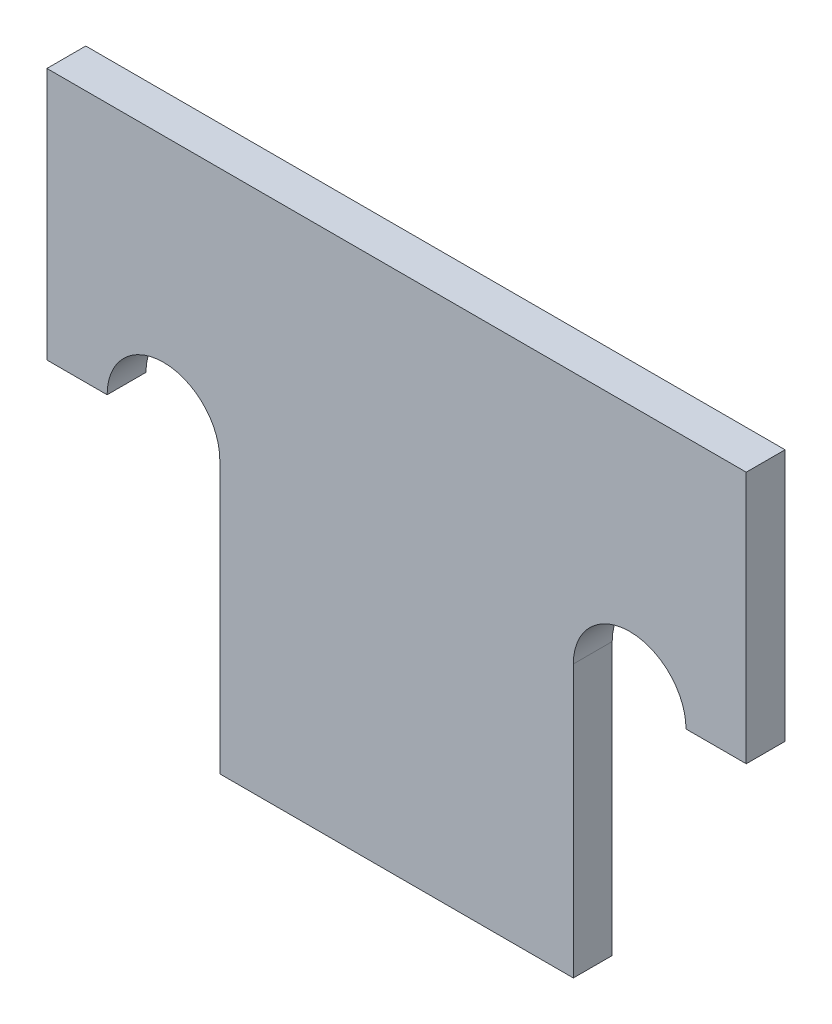
ISO-10303-21;
HEADER;
FILE_DESCRIPTION(('STEP AP214'),'2;1');
FILE_NAME('part.step','',(''),(''),'','','');
FILE_SCHEMA(('AUTOMOTIVE_DESIGN { 1 0 10303 214 1 1 1 1 }'));
ENDSEC;
DATA;
#1=APPLICATION_CONTEXT('core data for automotive mechanical design processes');
#2=APPLICATION_PROTOCOL_DEFINITION('international standard','automotive_design',2000,#1);
#3=PRODUCT_CONTEXT('',#1,'mechanical');
#4=PRODUCT('Part','Part','',(#3));
#5=PRODUCT_RELATED_PRODUCT_CATEGORY('part','',(#4));
#6=PRODUCT_DEFINITION_FORMATION('','',#4);
#7=PRODUCT_DEFINITION_CONTEXT('part definition',#1,'design');
#8=PRODUCT_DEFINITION('design','',#6,#7);
#9=PRODUCT_DEFINITION_SHAPE('','',#8);
#10=(LENGTH_UNIT() NAMED_UNIT(*) SI_UNIT(.MILLI.,.METRE.));
#11=(NAMED_UNIT(*) PLANE_ANGLE_UNIT() SI_UNIT($,.RADIAN.));
#12=(NAMED_UNIT(*) SI_UNIT($,.STERADIAN.) SOLID_ANGLE_UNIT());
#13=UNCERTAINTY_MEASURE_WITH_UNIT(LENGTH_MEASURE(1.E-05),#10,'distance_accuracy_value','');
#14=(GEOMETRIC_REPRESENTATION_CONTEXT(3) GLOBAL_UNCERTAINTY_ASSIGNED_CONTEXT((#13)) GLOBAL_UNIT_ASSIGNED_CONTEXT((#10,
#11,#12)) REPRESENTATION_CONTEXT('',''));
#15=CARTESIAN_POINT('',(0.,0.,0.));
#16=DIRECTION('',(0.,0.,1.));
#17=DIRECTION('',(1.,0.,0.));
#18=AXIS2_PLACEMENT_3D('',#15,#16,#17);
#19=CARTESIAN_POINT('',(0.,0.,2.54));
#20=DIRECTION('',(0.,0.,-1.));
#21=DIRECTION('',(-1.,0.,0.));
#22=AXIS2_PLACEMENT_3D('',#19,#20,#21);
#23=PLANE('',#22);
#24=DIRECTION('',(1.,0.,0.));
#25=VECTOR('',#24,1.);
#26=CARTESIAN_POINT('',(18.923,0.635000000000004,2.54));
#27=LINE('',#26,#25);
#28=CARTESIAN_POINT('',(18.923,0.635000000000004,2.54));
#29=VERTEX_POINT('',#28);
#30=CARTESIAN_POINT('',(22.86,0.635000000000004,2.54));
#31=VERTEX_POINT('',#30);
#32=EDGE_CURVE('E129',#29,#31,#27,.T.);
#33=ORIENTED_EDGE('',*,*,#32,.T.);
#34=DIRECTION('',(0.,1.,0.));
#35=VECTOR('',#34,1.);
#36=CARTESIAN_POINT('',(22.86,-17.145,2.54));
#37=LINE('',#36,#35);
#38=CARTESIAN_POINT('',(22.86,17.145,2.54));
#39=VERTEX_POINT('',#38);
#40=EDGE_CURVE('E196',#31,#39,#37,.T.);
#41=ORIENTED_EDGE('',*,*,#40,.T.);
#42=DIRECTION('',(-1.,0.,0.));
#43=VECTOR('',#42,1.);
#44=CARTESIAN_POINT('',(-22.86,17.145,2.54));
#45=LINE('',#44,#43);
#46=CARTESIAN_POINT('',(-22.86,17.145,2.54));
#47=VERTEX_POINT('',#46);
#48=EDGE_CURVE('E199',#39,#47,#45,.T.);
#49=ORIENTED_EDGE('',*,*,#48,.T.);
#50=DIRECTION('',(0.,-1.,0.));
#51=VECTOR('',#50,1.);
#52=CARTESIAN_POINT('',(-22.86,-17.145,2.54));
#53=LINE('',#52,#51);
#54=CARTESIAN_POINT('',(-22.86,0.635000000000003,2.54));
#55=VERTEX_POINT('',#54);
#56=EDGE_CURVE('E203',#47,#55,#53,.T.);
#57=ORIENTED_EDGE('',*,*,#56,.T.);
#58=DIRECTION('',(1.,0.,0.));
#59=VECTOR('',#58,1.);
#60=CARTESIAN_POINT('',(-18.923,0.635000000000004,2.54));
#61=LINE('',#60,#59);
#62=CARTESIAN_POINT('',(-18.923,0.635000000000004,2.54));
#63=VERTEX_POINT('',#62);
#64=EDGE_CURVE('E169',#55,#63,#61,.T.);
#65=ORIENTED_EDGE('',*,*,#64,.T.);
#66=CARTESIAN_POINT('',(-15.24,0.635000000000004,2.54));
#67=DIRECTION('',(0.,0.,-1.));
#68=DIRECTION('',(-1.,0.,0.));
#69=AXIS2_PLACEMENT_3D('',#66,#67,#68);
#70=CIRCLE('',#69,3.683);
#71=CARTESIAN_POINT('',(-11.557,0.635000000000004,2.54));
#72=VERTEX_POINT('',#71);
#73=EDGE_CURVE('E148',#63,#72,#70,.T.);
#74=ORIENTED_EDGE('',*,*,#73,.T.);
#75=DIRECTION('',(0.,-1.,0.));
#76=VECTOR('',#75,1.);
#77=CARTESIAN_POINT('',(-11.557,0.635000000000003,2.54));
#78=LINE('',#77,#76);
#79=CARTESIAN_POINT('',(-11.557,-17.145,2.54));
#80=VERTEX_POINT('',#79);
#81=EDGE_CURVE('E144',#72,#80,#78,.T.);
#82=ORIENTED_EDGE('',*,*,#81,.T.);
#83=DIRECTION('',(1.,0.,0.));
#84=VECTOR('',#83,1.);
#85=CARTESIAN_POINT('',(-22.86,-17.145,2.54));
#86=LINE('',#85,#84);
#87=CARTESIAN_POINT('',(11.557,-17.145,2.54));
#88=VERTEX_POINT('',#87);
#89=EDGE_CURVE('E207',#80,#88,#86,.T.);
#90=ORIENTED_EDGE('',*,*,#89,.T.);
#91=DIRECTION('',(0.,1.,0.));
#92=VECTOR('',#91,1.);
#93=CARTESIAN_POINT('',(11.557,0.635000000000003,2.54));
#94=LINE('',#93,#92);
#95=CARTESIAN_POINT('',(11.557,0.635000000000003,2.54));
#96=VERTEX_POINT('',#95);
#97=EDGE_CURVE('E57',#88,#96,#94,.T.);
#98=ORIENTED_EDGE('',*,*,#97,.T.);
#99=CARTESIAN_POINT('',(15.24,0.635000000000004,2.54));
#100=DIRECTION('',(0.,0.,-1.));
#101=DIRECTION('',(-1.,0.,0.));
#102=AXIS2_PLACEMENT_3D('',#99,#100,#101);
#103=CIRCLE('',#102,3.683);
#104=EDGE_CURVE('E127',#96,#29,#103,.T.);
#105=ORIENTED_EDGE('',*,*,#104,.T.);
#106=EDGE_LOOP('',(#33,#41,#49,#57,#65,#74,#82,#90,#98,#105));
#107=FACE_BOUND('',#106,.T.);
#108=ADVANCED_FACE('F41',(#107),#23,.F.);
#109=CARTESIAN_POINT('',(0.,0.,0.));
#110=DIRECTION('',(0.,0.,-1.));
#111=DIRECTION('',(-1.,0.,0.));
#112=AXIS2_PLACEMENT_3D('',#109,#110,#111);
#113=PLANE('',#112);
#114=DIRECTION('',(0.,1.,0.));
#115=VECTOR('',#114,1.);
#116=CARTESIAN_POINT('',(22.86,-17.145,0.));
#117=LINE('',#116,#115);
#118=CARTESIAN_POINT('',(22.86,0.635000000000004,0.));
#119=VERTEX_POINT('',#118);
#120=CARTESIAN_POINT('',(22.86,17.145,0.));
#121=VERTEX_POINT('',#120);
#122=EDGE_CURVE('E211',#119,#121,#117,.T.);
#123=ORIENTED_EDGE('',*,*,#122,.F.);
#124=DIRECTION('',(-1.,0.,0.));
#125=VECTOR('',#124,1.);
#126=CARTESIAN_POINT('',(18.923,0.635000000000004,0.));
#127=LINE('',#126,#125);
#128=CARTESIAN_POINT('',(18.923,0.635000000000004,0.));
#129=VERTEX_POINT('',#128);
#130=EDGE_CURVE('E139',#119,#129,#127,.T.);
#131=ORIENTED_EDGE('',*,*,#130,.T.);
#132=CARTESIAN_POINT('',(15.24,0.635000000000004,0.));
#133=DIRECTION('',(0.,0.,1.));
#134=DIRECTION('',(1.,0.,0.));
#135=AXIS2_PLACEMENT_3D('',#132,#133,#134);
#136=CIRCLE('',#135,3.683);
#137=CARTESIAN_POINT('',(11.557,0.635000000000003,0.));
#138=VERTEX_POINT('',#137);
#139=EDGE_CURVE('E124',#129,#138,#136,.T.);
#140=ORIENTED_EDGE('',*,*,#139,.T.);
#141=DIRECTION('',(0.,-1.,0.));
#142=VECTOR('',#141,1.);
#143=CARTESIAN_POINT('',(11.557,0.635000000000003,0.));
#144=LINE('',#143,#142);
#145=CARTESIAN_POINT('',(11.557,-17.145,0.));
#146=VERTEX_POINT('',#145);
#147=EDGE_CURVE('E133',#138,#146,#144,.T.);
#148=ORIENTED_EDGE('',*,*,#147,.T.);
#149=DIRECTION('',(1.,0.,0.));
#150=VECTOR('',#149,1.);
#151=CARTESIAN_POINT('',(-22.86,-17.145,0.));
#152=LINE('',#151,#150);
#153=CARTESIAN_POINT('',(-11.557,-17.145,0.));
#154=VERTEX_POINT('',#153);
#155=EDGE_CURVE('E200',#154,#146,#152,.T.);
#156=ORIENTED_EDGE('',*,*,#155,.F.);
#157=DIRECTION('',(0.,1.,0.));
#158=VECTOR('',#157,1.);
#159=CARTESIAN_POINT('',(-11.557,0.635000000000003,0.));
#160=LINE('',#159,#158);
#161=CARTESIAN_POINT('',(-11.557,0.635000000000004,0.));
#162=VERTEX_POINT('',#161);
#163=EDGE_CURVE('E65',#154,#162,#160,.T.);
#164=ORIENTED_EDGE('',*,*,#163,.T.);
#165=CARTESIAN_POINT('',(-15.24,0.635000000000004,0.));
#166=DIRECTION('',(0.,0.,1.));
#167=DIRECTION('',(-1.,0.,0.));
#168=AXIS2_PLACEMENT_3D('',#165,#166,#167);
#169=CIRCLE('',#168,3.683);
#170=CARTESIAN_POINT('',(-18.923,0.635000000000004,0.));
#171=VERTEX_POINT('',#170);
#172=EDGE_CURVE('E173',#162,#171,#169,.T.);
#173=ORIENTED_EDGE('',*,*,#172,.T.);
#174=DIRECTION('',(-1.,0.,0.));
#175=VECTOR('',#174,1.);
#176=CARTESIAN_POINT('',(-18.923,0.635000000000004,0.));
#177=LINE('',#176,#175);
#178=CARTESIAN_POINT('',(-22.86,0.635000000000003,0.));
#179=VERTEX_POINT('',#178);
#180=EDGE_CURVE('E177',#171,#179,#177,.T.);
#181=ORIENTED_EDGE('',*,*,#180,.T.);
#182=DIRECTION('',(0.,-1.,0.));
#183=VECTOR('',#182,1.);
#184=CARTESIAN_POINT('',(-22.86,-17.145,0.));
#185=LINE('',#184,#183);
#186=CARTESIAN_POINT('',(-22.86,17.145,0.));
#187=VERTEX_POINT('',#186);
#188=EDGE_CURVE('E217',#187,#179,#185,.T.);
#189=ORIENTED_EDGE('',*,*,#188,.F.);
#190=DIRECTION('',(-1.,0.,0.));
#191=VECTOR('',#190,1.);
#192=CARTESIAN_POINT('',(-22.86,17.145,0.));
#193=LINE('',#192,#191);
#194=EDGE_CURVE('E214',#121,#187,#193,.T.);
#195=ORIENTED_EDGE('',*,*,#194,.F.);
#196=EDGE_LOOP('',(#123,#131,#140,#148,#156,#164,#173,#181,#189,#195));
#197=FACE_BOUND('',#196,.T.);
#198=ADVANCED_FACE('F142',(#197),#113,.T.);
#199=CARTESIAN_POINT('',(22.86,-17.145,2.54));
#200=DIRECTION('',(-1.,0.,0.));
#201=DIRECTION('',(0.,0.,1.));
#202=AXIS2_PLACEMENT_3D('',#199,#200,#201);
#203=PLANE('',#202);
#204=DIRECTION('',(0.,0.,-1.));
#205=VECTOR('',#204,1.);
#206=CARTESIAN_POINT('',(22.86,0.635000000000004,26.7973324584547));
#207=LINE('',#206,#205);
#208=EDGE_CURVE('E158',#31,#119,#207,.T.);
#209=ORIENTED_EDGE('',*,*,#208,.T.);
#210=ORIENTED_EDGE('',*,*,#122,.T.);
#211=DIRECTION('',(0.,0.,-1.));
#212=VECTOR('',#211,1.);
#213=CARTESIAN_POINT('',(22.86,17.145,2.54));
#214=LINE('',#213,#212);
#215=EDGE_CURVE('E11',#39,#121,#214,.T.);
#216=ORIENTED_EDGE('',*,*,#215,.F.);
#217=ORIENTED_EDGE('',*,*,#40,.F.);
#218=EDGE_LOOP('',(#209,#210,#216,#217));
#219=FACE_BOUND('',#218,.T.);
#220=ADVANCED_FACE('F43',(#219),#203,.F.);
#221=CARTESIAN_POINT('',(-22.86,-17.145,2.54));
#222=DIRECTION('',(1.,0.,0.));
#223=DIRECTION('',(0.,0.,-1.));
#224=AXIS2_PLACEMENT_3D('',#221,#222,#223);
#225=PLANE('',#224);
#226=DIRECTION('',(0.,0.,-1.));
#227=VECTOR('',#226,1.);
#228=CARTESIAN_POINT('',(-22.86,0.635000000000003,26.7973324584547));
#229=LINE('',#228,#227);
#230=EDGE_CURVE('E181',#55,#179,#229,.T.);
#231=ORIENTED_EDGE('',*,*,#230,.F.);
#232=ORIENTED_EDGE('',*,*,#56,.F.);
#233=DIRECTION('',(0.,0.,-1.));
#234=VECTOR('',#233,1.);
#235=CARTESIAN_POINT('',(-22.86,17.145,2.54));
#236=LINE('',#235,#234);
#237=EDGE_CURVE('E50',#47,#187,#236,.T.);
#238=ORIENTED_EDGE('',*,*,#237,.T.);
#239=ORIENTED_EDGE('',*,*,#188,.T.);
#240=EDGE_LOOP('',(#231,#232,#238,#239));
#241=FACE_BOUND('',#240,.T.);
#242=ADVANCED_FACE('F229',(#241),#225,.F.);
#243=CARTESIAN_POINT('',(-22.86,-17.145,2.54));
#244=DIRECTION('',(0.,1.,0.));
#245=DIRECTION('',(0.,0.,1.));
#246=AXIS2_PLACEMENT_3D('',#243,#244,#245);
#247=PLANE('',#246);
#248=DIRECTION('',(0.,0.,-1.));
#249=VECTOR('',#248,1.);
#250=CARTESIAN_POINT('',(11.557,-17.145,26.7973324584547));
#251=LINE('',#250,#249);
#252=EDGE_CURVE('E130',#88,#146,#251,.T.);
#253=ORIENTED_EDGE('',*,*,#252,.F.);
#254=ORIENTED_EDGE('',*,*,#89,.F.);
#255=DIRECTION('',(0.,0.,-1.));
#256=VECTOR('',#255,1.);
#257=CARTESIAN_POINT('',(-11.557,-17.145,26.7973324584547));
#258=LINE('',#257,#256);
#259=EDGE_CURVE('E190',#80,#154,#258,.T.);
#260=ORIENTED_EDGE('',*,*,#259,.T.);
#261=ORIENTED_EDGE('',*,*,#155,.T.);
#262=EDGE_LOOP('',(#253,#254,#260,#261));
#263=FACE_BOUND('',#262,.T.);
#264=ADVANCED_FACE('F249',(#263),#247,.F.);
#265=CARTESIAN_POINT('',(-22.86,17.145,2.54));
#266=DIRECTION('',(0.,-1.,0.));
#267=DIRECTION('',(0.,0.,-1.));
#268=AXIS2_PLACEMENT_3D('',#265,#266,#267);
#269=PLANE('',#268);
#270=ORIENTED_EDGE('',*,*,#194,.T.);
#271=ORIENTED_EDGE('',*,*,#237,.F.);
#272=ORIENTED_EDGE('',*,*,#48,.F.);
#273=ORIENTED_EDGE('',*,*,#215,.T.);
#274=EDGE_LOOP('',(#270,#271,#272,#273));
#275=FACE_BOUND('',#274,.T.);
#276=ADVANCED_FACE('F241',(#275),#269,.F.);
#277=CARTESIAN_POINT('',(-18.923,0.635000000000004,26.7973324584547));
#278=DIRECTION('',(0.,-1.,0.));
#279=DIRECTION('',(1.,0.,0.));
#280=AXIS2_PLACEMENT_3D('',#277,#278,#279);
#281=PLANE('',#280);
#282=ORIENTED_EDGE('',*,*,#230,.T.);
#283=ORIENTED_EDGE('',*,*,#180,.F.);
#284=DIRECTION('',(0.,0.,-1.));
#285=VECTOR('',#284,1.);
#286=CARTESIAN_POINT('',(-18.923,0.635000000000004,26.7973324584547));
#287=LINE('',#286,#285);
#288=EDGE_CURVE('E184',#63,#171,#287,.T.);
#289=ORIENTED_EDGE('',*,*,#288,.F.);
#290=ORIENTED_EDGE('',*,*,#64,.F.);
#291=EDGE_LOOP('',(#282,#283,#289,#290));
#292=FACE_BOUND('',#291,.T.);
#293=ADVANCED_FACE('F237',(#292),#281,.T.);
#294=CARTESIAN_POINT('',(-15.24,0.635000000000004,26.7973324584547));
#295=DIRECTION('',(0.,0.,-1.));
#296=DIRECTION('',(-1.,0.,0.));
#297=AXIS2_PLACEMENT_3D('',#294,#295,#296);
#298=CYLINDRICAL_SURFACE('',#297,3.683);
#299=ORIENTED_EDGE('',*,*,#288,.T.);
#300=ORIENTED_EDGE('',*,*,#172,.F.);
#301=DIRECTION('',(0.,0.,-1.));
#302=VECTOR('',#301,1.);
#303=CARTESIAN_POINT('',(-11.557,0.635000000000004,26.7973324584547));
#304=LINE('',#303,#302);
#305=EDGE_CURVE('E187',#72,#162,#304,.T.);
#306=ORIENTED_EDGE('',*,*,#305,.F.);
#307=ORIENTED_EDGE('',*,*,#73,.F.);
#308=EDGE_LOOP('',(#299,#300,#306,#307));
#309=FACE_BOUND('',#308,.T.);
#310=ADVANCED_FACE('F253',(#309),#298,.F.);
#311=CARTESIAN_POINT('',(-11.557,0.635000000000003,26.7973324584547));
#312=DIRECTION('',(-1.,0.,0.));
#313=DIRECTION('',(0.,0.,1.));
#314=AXIS2_PLACEMENT_3D('',#311,#312,#313);
#315=PLANE('',#314);
#316=ORIENTED_EDGE('',*,*,#305,.T.);
#317=ORIENTED_EDGE('',*,*,#163,.F.);
#318=ORIENTED_EDGE('',*,*,#259,.F.);
#319=ORIENTED_EDGE('',*,*,#81,.F.);
#320=EDGE_LOOP('',(#316,#317,#318,#319));
#321=FACE_BOUND('',#320,.T.);
#322=ADVANCED_FACE('F250',(#321),#315,.T.);
#323=CARTESIAN_POINT('',(18.923,0.635000000000004,26.7973324584547));
#324=DIRECTION('',(0.,-1.,0.));
#325=DIRECTION('',(0.,0.,-1.));
#326=AXIS2_PLACEMENT_3D('',#323,#324,#325);
#327=PLANE('',#326);
#328=DIRECTION('',(0.,0.,-1.));
#329=VECTOR('',#328,1.);
#330=CARTESIAN_POINT('',(18.923,0.635000000000004,26.7973324584547));
#331=LINE('',#330,#329);
#332=EDGE_CURVE('E155',#29,#129,#331,.T.);
#333=ORIENTED_EDGE('',*,*,#332,.T.);
#334=ORIENTED_EDGE('',*,*,#130,.F.);
#335=ORIENTED_EDGE('',*,*,#208,.F.);
#336=ORIENTED_EDGE('',*,*,#32,.F.);
#337=EDGE_LOOP('',(#333,#334,#335,#336));
#338=FACE_BOUND('',#337,.T.);
#339=ADVANCED_FACE('F244',(#338),#327,.T.);
#340=CARTESIAN_POINT('',(11.557,0.635000000000003,26.7973324584547));
#341=DIRECTION('',(1.,0.,0.));
#342=DIRECTION('',(0.,0.,-1.));
#343=AXIS2_PLACEMENT_3D('',#340,#341,#342);
#344=PLANE('',#343);
#345=ORIENTED_EDGE('',*,*,#252,.T.);
#346=ORIENTED_EDGE('',*,*,#147,.F.);
#347=DIRECTION('',(0.,0.,-1.));
#348=VECTOR('',#347,1.);
#349=CARTESIAN_POINT('',(11.557,0.635000000000003,26.7973324584547));
#350=LINE('',#349,#348);
#351=EDGE_CURVE('E119',#96,#138,#350,.T.);
#352=ORIENTED_EDGE('',*,*,#351,.F.);
#353=ORIENTED_EDGE('',*,*,#97,.F.);
#354=EDGE_LOOP('',(#345,#346,#352,#353));
#355=FACE_BOUND('',#354,.T.);
#356=ADVANCED_FACE('F134',(#355),#344,.T.);
#357=CARTESIAN_POINT('',(15.24,0.635000000000004,26.7973324584547));
#358=DIRECTION('',(0.,0.,-1.));
#359=DIRECTION('',(-1.,0.,0.));
#360=AXIS2_PLACEMENT_3D('',#357,#358,#359);
#361=CYLINDRICAL_SURFACE('',#360,3.683);
#362=ORIENTED_EDGE('',*,*,#351,.T.);
#363=ORIENTED_EDGE('',*,*,#139,.F.);
#364=ORIENTED_EDGE('',*,*,#332,.F.);
#365=ORIENTED_EDGE('',*,*,#104,.F.);
#366=EDGE_LOOP('',(#362,#363,#364,#365));
#367=FACE_BOUND('',#366,.T.);
#368=ADVANCED_FACE('F121',(#367),#361,.F.);
#369=CLOSED_SHELL('',(#108,#198,#220,#242,#264,#276,#293,#310,#322,#339,#356,#368));
#370=MANIFOLD_SOLID_BREP('B2',#369);
#371=ADVANCED_BREP_SHAPE_REPRESENTATION('',(#18,#370),#14);
#372=SHAPE_DEFINITION_REPRESENTATION(#9,#371);
ENDSEC;
END-ISO-10303-21;
